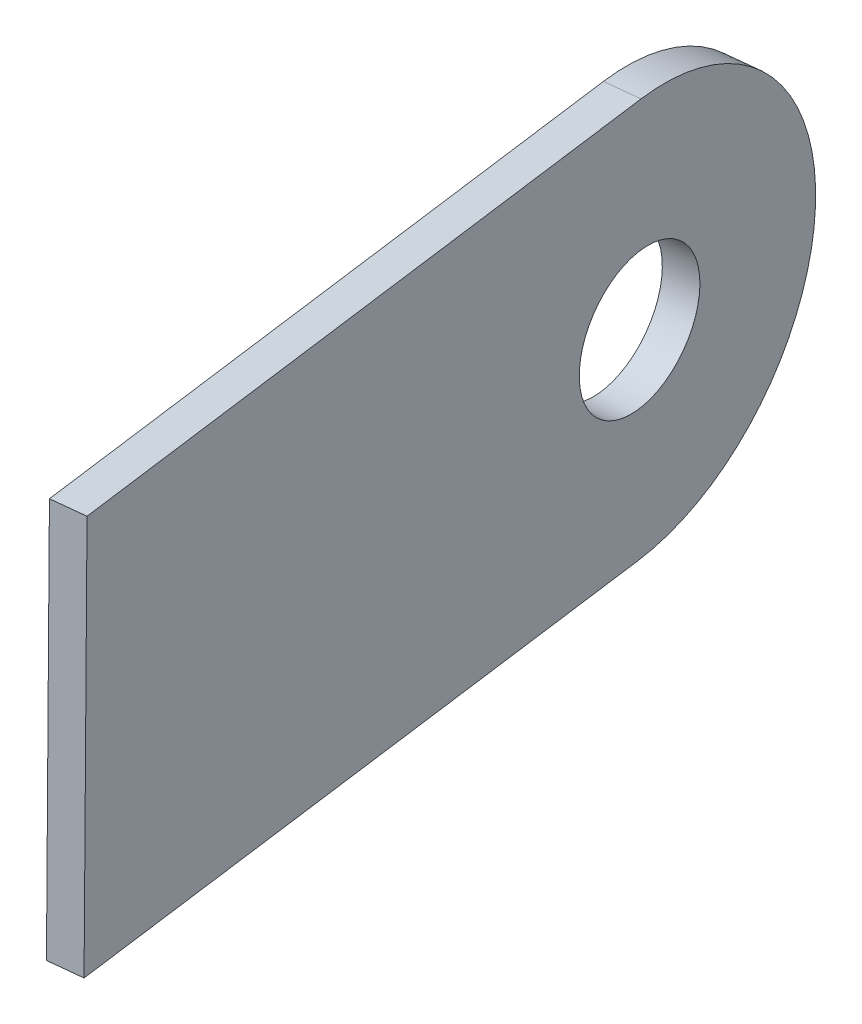
ISO-10303-21;
HEADER;
FILE_DESCRIPTION(('STEP AP214'),'2;1');
FILE_NAME('part.step','',(''),(''),'','','');
FILE_SCHEMA(('AUTOMOTIVE_DESIGN { 1 0 10303 214 1 1 1 1 }'));
ENDSEC;
DATA;
#1=APPLICATION_CONTEXT('core data for automotive mechanical design processes');
#2=APPLICATION_PROTOCOL_DEFINITION('international standard','automotive_design',2000,#1);
#3=PRODUCT_CONTEXT('',#1,'mechanical');
#4=PRODUCT('Part','Part','',(#3));
#5=PRODUCT_RELATED_PRODUCT_CATEGORY('part','',(#4));
#6=PRODUCT_DEFINITION_FORMATION('','',#4);
#7=PRODUCT_DEFINITION_CONTEXT('part definition',#1,'design');
#8=PRODUCT_DEFINITION('design','',#6,#7);
#9=PRODUCT_DEFINITION_SHAPE('','',#8);
#10=(LENGTH_UNIT() NAMED_UNIT(*) SI_UNIT(.MILLI.,.METRE.));
#11=(NAMED_UNIT(*) PLANE_ANGLE_UNIT() SI_UNIT($,.RADIAN.));
#12=(NAMED_UNIT(*) SI_UNIT($,.STERADIAN.) SOLID_ANGLE_UNIT());
#13=UNCERTAINTY_MEASURE_WITH_UNIT(LENGTH_MEASURE(1.E-05),#10,'distance_accuracy_value','');
#14=(GEOMETRIC_REPRESENTATION_CONTEXT(3) GLOBAL_UNCERTAINTY_ASSIGNED_CONTEXT((#13)) GLOBAL_UNIT_ASSIGNED_CONTEXT((#10,
#11,#12)) REPRESENTATION_CONTEXT('',''));
#15=CARTESIAN_POINT('',(0.,0.,0.));
#16=DIRECTION('',(0.,0.,1.));
#17=DIRECTION('',(1.,0.,0.));
#18=AXIS2_PLACEMENT_3D('',#15,#16,#17);
#19=CARTESIAN_POINT('',(310.522461072206,164.556054312671,-551.351632760482));
#20=DIRECTION('',(-0.992348265819815,0.0144812145690195,0.122618162394535));
#21=DIRECTION('',(0.122631021273154,0.,0.992452332669687));
#22=AXIS2_PLACEMENT_3D('',#19,#20,#21);
#23=PLANE('',#22);
#24=DIRECTION('',(-0.0156095263850588,-0.999844159646676,-0.00824615707260501));
#25=VECTOR('',#24,1.);
#26=CARTESIAN_POINT('',(314.044740078497,154.729909276672,-521.685375272667));
#27=LINE('',#26,#25);
#28=CARTESIAN_POINT('',(314.342101556132,173.776940517941,-521.528285980434));
#29=VERTEX_POINT('',#28);
#30=CARTESIAN_POINT('',(314.044740078497,154.729909276672,-521.685375272667));
#31=VERTEX_POINT('',#30);
#32=EDGE_CURVE('E93',#29,#31,#27,.T.);
#33=ORIENTED_EDGE('',*,*,#32,.T.);
#34=DIRECTION('',(-0.122479639166846,0.0100970711118644,-0.992419662816352));
#35=VECTOR('',#34,1.);
#36=CARTESIAN_POINT('',(310.373780333388,155.032538692037,-551.430177406599));
#37=LINE('',#36,#35);
#38=CARTESIAN_POINT('',(310.373780333388,155.032538692037,-551.430177406599));
#39=VERTEX_POINT('',#38);
#40=EDGE_CURVE('E88',#31,#39,#37,.T.);
#41=ORIENTED_EDGE('',*,*,#40,.T.);
#42=CARTESIAN_POINT('',(310.522461072206,164.556054312671,-551.351632760482));
#43=DIRECTION('',(0.992348265819815,-0.0144812145690195,-0.122618162394535));
#44=DIRECTION('',(0.122631021273154,0.,0.992452332669687));
#45=AXIS2_PLACEMENT_3D('',#42,#43,#44);
#46=CIRCLE('',#45,9.52500000000001);
#47=CARTESIAN_POINT('',(310.671141811024,174.079569933306,-551.273088114365));
#48=VERTEX_POINT('',#47);
#49=EDGE_CURVE('E91',#39,#48,#46,.T.);
#50=ORIENTED_EDGE('',*,*,#49,.T.);
#51=DIRECTION('',(0.122479639166846,-0.0100970711118634,0.992419662816352));
#52=VECTOR('',#51,1.);
#53=CARTESIAN_POINT('',(314.342101556132,173.776940517941,-521.528285980434));
#54=LINE('',#53,#52);
#55=EDGE_CURVE('E58',#48,#29,#54,.T.);
#56=ORIENTED_EDGE('',*,*,#55,.T.);
#57=EDGE_LOOP('',(#33,#41,#50,#56));
#58=FACE_BOUND('',#57,.T.);
#59=CARTESIAN_POINT('',(310.522461072206,164.556054312671,-551.351632760482));
#60=DIRECTION('',(0.992348265819815,-0.0144812145690195,-0.122618162394535));
#61=DIRECTION('',(-0.122631021273154,0.,-0.992452332669687));
#62=AXIS2_PLACEMENT_3D('',#59,#60,#61);
#63=CIRCLE('',#62,3.26389999999999);
#64=CARTESIAN_POINT('',(310.122205681873,164.556054312671,-554.590897929083));
#65=VERTEX_POINT('',#64);
#66=EDGE_CURVE('E108',#65,#65,#63,.T.);
#67=ORIENTED_EDGE('',*,*,#66,.F.);
#68=EDGE_LOOP('',(#67));
#69=FACE_BOUND('',#68,.T.);
#70=ADVANCED_FACE('F41',(#58,#69),#23,.F.);
#71=CARTESIAN_POINT('',(308.947108200217,164.5790432408,-551.156976427681));
#72=DIRECTION('',(-0.992348265819815,0.0144812145690195,0.122618162394535));
#73=DIRECTION('',(0.122631021273154,0.,0.992452332669687));
#74=AXIS2_PLACEMENT_3D('',#71,#72,#73);
#75=PLANE('',#74);
#76=DIRECTION('',(-0.0156095263850588,-0.999844159646676,-0.00824615707260501));
#77=VECTOR('',#76,1.);
#78=CARTESIAN_POINT('',(312.469387206508,154.7528982048,-521.490718939866));
#79=LINE('',#78,#77);
#80=CARTESIAN_POINT('',(312.766748684143,173.79992944607,-521.333629647633));
#81=VERTEX_POINT('',#80);
#82=CARTESIAN_POINT('',(312.469387206508,154.7528982048,-521.490718939866));
#83=VERTEX_POINT('',#82);
#84=EDGE_CURVE('E105',#81,#83,#79,.T.);
#85=ORIENTED_EDGE('',*,*,#84,.F.);
#86=DIRECTION('',(0.122479639166846,-0.0100970711118634,0.992419662816352));
#87=VECTOR('',#86,1.);
#88=CARTESIAN_POINT('',(312.766748684143,173.79992944607,-521.333629647633));
#89=LINE('',#88,#87);
#90=CARTESIAN_POINT('',(309.095788939035,174.102558861434,-551.078431781564));
#91=VERTEX_POINT('',#90);
#92=EDGE_CURVE('E81',#91,#81,#89,.T.);
#93=ORIENTED_EDGE('',*,*,#92,.F.);
#94=CARTESIAN_POINT('',(308.947108200217,164.5790432408,-551.156976427681));
#95=DIRECTION('',(0.992348265819815,-0.0144812145690195,-0.122618162394535));
#96=DIRECTION('',(0.122631021273154,0.,0.992452332669687));
#97=AXIS2_PLACEMENT_3D('',#94,#95,#96);
#98=CIRCLE('',#97,9.52500000000001);
#99=CARTESIAN_POINT('',(308.798427461399,155.055527620165,-551.235521073797));
#100=VERTEX_POINT('',#99);
#101=EDGE_CURVE('E75',#100,#91,#98,.T.);
#102=ORIENTED_EDGE('',*,*,#101,.F.);
#103=DIRECTION('',(-0.122479639166846,0.0100970711118644,-0.992419662816352));
#104=VECTOR('',#103,1.);
#105=CARTESIAN_POINT('',(308.798427461399,155.055527620165,-551.235521073797));
#106=LINE('',#105,#104);
#107=EDGE_CURVE('E97',#83,#100,#106,.T.);
#108=ORIENTED_EDGE('',*,*,#107,.F.);
#109=EDGE_LOOP('',(#85,#93,#102,#108));
#110=FACE_BOUND('',#109,.T.);
#111=CARTESIAN_POINT('',(308.947108200217,164.5790432408,-551.156976427681));
#112=DIRECTION('',(0.992348265819815,-0.0144812145690195,-0.122618162394535));
#113=DIRECTION('',(-0.122631021273154,0.,-0.992452332669687));
#114=AXIS2_PLACEMENT_3D('',#111,#112,#113);
#115=CIRCLE('',#114,3.26389999999999);
#116=CARTESIAN_POINT('',(308.546852809884,164.5790432408,-554.396241596281));
#117=VERTEX_POINT('',#116);
#118=EDGE_CURVE('E120',#117,#117,#115,.T.);
#119=ORIENTED_EDGE('',*,*,#118,.T.);
#120=EDGE_LOOP('',(#119));
#121=FACE_BOUND('',#120,.T.);
#122=ADVANCED_FACE('F116',(#110,#121),#75,.T.);
#123=CARTESIAN_POINT('',(314.044740078497,154.729909276672,-521.685375272667));
#124=DIRECTION('',(-0.122479639166846,0.0100970711118623,-0.992419662816352));
#125=DIRECTION('',(-0.992470255696503,0.,0.122485883095637));
#126=AXIS2_PLACEMENT_3D('',#123,#124,#125);
#127=PLANE('',#126);
#128=ORIENTED_EDGE('',*,*,#84,.T.);
#129=DIRECTION('',(-0.992348265819815,0.0144812145690195,0.122618162394535));
#130=VECTOR('',#129,1.);
#131=CARTESIAN_POINT('',(314.044740078497,154.729909276672,-521.685375272667));
#132=LINE('',#131,#130);
#133=EDGE_CURVE('E11',#31,#83,#132,.T.);
#134=ORIENTED_EDGE('',*,*,#133,.F.);
#135=ORIENTED_EDGE('',*,*,#32,.F.);
#136=DIRECTION('',(-0.992348265819815,0.0144812145690195,0.122618162394535));
#137=VECTOR('',#136,1.);
#138=CARTESIAN_POINT('',(314.342101556132,173.776940517941,-521.528285980434));
#139=LINE('',#138,#137);
#140=EDGE_CURVE('E101',#29,#81,#139,.T.);
#141=ORIENTED_EDGE('',*,*,#140,.T.);
#142=EDGE_LOOP('',(#128,#134,#135,#141));
#143=FACE_BOUND('',#142,.T.);
#144=ADVANCED_FACE('F43',(#143),#127,.F.);
#145=CARTESIAN_POINT('',(310.373780333388,155.032538692037,-551.430177406599));
#146=DIRECTION('',(0.0156095263850614,0.999844159646676,0.00824615707260677));
#147=DIRECTION('',(-0.999878155635189,0.0156100571290524,0.));
#148=AXIS2_PLACEMENT_3D('',#145,#146,#147);
#149=PLANE('',#148);
#150=ORIENTED_EDGE('',*,*,#107,.T.);
#151=DIRECTION('',(-0.992348265819815,0.0144812145690195,0.122618162394535));
#152=VECTOR('',#151,1.);
#153=CARTESIAN_POINT('',(310.373780333388,155.032538692037,-551.430177406599));
#154=LINE('',#153,#152);
#155=EDGE_CURVE('E50',#39,#100,#154,.T.);
#156=ORIENTED_EDGE('',*,*,#155,.F.);
#157=ORIENTED_EDGE('',*,*,#40,.F.);
#158=ORIENTED_EDGE('',*,*,#133,.T.);
#159=EDGE_LOOP('',(#150,#156,#157,#158));
#160=FACE_BOUND('',#159,.T.);
#161=ADVANCED_FACE('F96',(#160),#149,.F.);
#162=CARTESIAN_POINT('',(310.522461072206,164.556054312671,-551.351632760482));
#163=DIRECTION('',(-0.992348265819815,0.0144812145690195,0.122618162394535));
#164=DIRECTION('',(0.122631021273154,0.,0.992452332669687));
#165=AXIS2_PLACEMENT_3D('',#162,#163,#164);
#166=CYLINDRICAL_SURFACE('',#165,9.52500000000001);
#167=ORIENTED_EDGE('',*,*,#101,.T.);
#168=DIRECTION('',(-0.992348265819815,0.0144812145690195,0.122618162394535));
#169=VECTOR('',#168,1.);
#170=CARTESIAN_POINT('',(310.671141811024,174.079569933306,-551.273088114365));
#171=LINE('',#170,#169);
#172=EDGE_CURVE('E98',#48,#91,#171,.T.);
#173=ORIENTED_EDGE('',*,*,#172,.F.);
#174=ORIENTED_EDGE('',*,*,#49,.F.);
#175=ORIENTED_EDGE('',*,*,#155,.T.);
#176=EDGE_LOOP('',(#167,#173,#174,#175));
#177=FACE_BOUND('',#176,.T.);
#178=ADVANCED_FACE('F99',(#177),#166,.T.);
#179=CARTESIAN_POINT('',(314.342101556132,173.776940517941,-521.528285980434));
#180=DIRECTION('',(-0.0156095263850613,-0.999844159646676,-0.00824615707260585));
#181=DIRECTION('',(0.999878155635189,-0.0156100571290523,0.));
#182=AXIS2_PLACEMENT_3D('',#179,#180,#181);
#183=PLANE('',#182);
#184=ORIENTED_EDGE('',*,*,#92,.T.);
#185=ORIENTED_EDGE('',*,*,#140,.F.);
#186=ORIENTED_EDGE('',*,*,#55,.F.);
#187=ORIENTED_EDGE('',*,*,#172,.T.);
#188=EDGE_LOOP('',(#184,#185,#186,#187));
#189=FACE_BOUND('',#188,.T.);
#190=ADVANCED_FACE('F113',(#189),#183,.F.);
#191=CARTESIAN_POINT('',(310.522461072206,164.556054312671,-551.351632760482));
#192=DIRECTION('',(-0.992348265819815,0.0144812145690195,0.122618162394535));
#193=DIRECTION('',(0.122631021273154,0.,0.992452332669687));
#194=AXIS2_PLACEMENT_3D('',#191,#192,#193);
#195=CYLINDRICAL_SURFACE('',#194,3.26389999999999);
#196=ORIENTED_EDGE('',*,*,#66,.T.);
#197=EDGE_LOOP('',(#196));
#198=FACE_BOUND('',#197,.T.);
#199=ORIENTED_EDGE('',*,*,#118,.F.);
#200=EDGE_LOOP('',(#199));
#201=FACE_BOUND('',#200,.T.);
#202=ADVANCED_FACE('F126',(#198,#201),#195,.F.);
#203=CLOSED_SHELL('',(#70,#122,#144,#161,#178,#190,#202));
#204=MANIFOLD_SOLID_BREP('B2',#203);
#205=ADVANCED_BREP_SHAPE_REPRESENTATION('',(#18,#204),#14);
#206=SHAPE_DEFINITION_REPRESENTATION(#9,#205);
ENDSEC;
END-ISO-10303-21;
